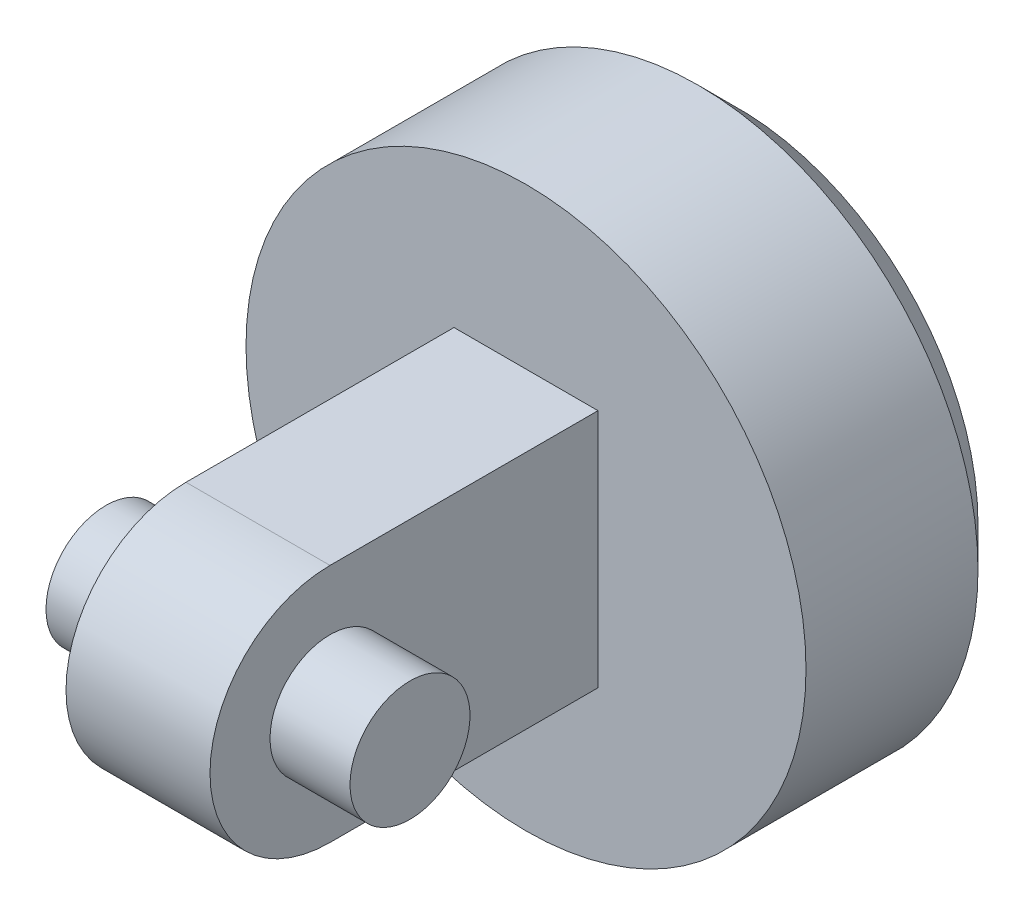
ISO-10303-21;
HEADER;
FILE_DESCRIPTION(('STEP AP214'),'2;1');
FILE_NAME('part.step','',(''),(''),'','','');
FILE_SCHEMA(('AUTOMOTIVE_DESIGN { 1 0 10303 214 1 1 1 1 }'));
ENDSEC;
DATA;
#1=APPLICATION_CONTEXT('core data for automotive mechanical design processes');
#2=APPLICATION_PROTOCOL_DEFINITION('international standard','automotive_design',2000,#1);
#3=PRODUCT_CONTEXT('',#1,'mechanical');
#4=PRODUCT('Part','Part','',(#3));
#5=PRODUCT_RELATED_PRODUCT_CATEGORY('part','',(#4));
#6=PRODUCT_DEFINITION_FORMATION('','',#4);
#7=PRODUCT_DEFINITION_CONTEXT('part definition',#1,'design');
#8=PRODUCT_DEFINITION('design','',#6,#7);
#9=PRODUCT_DEFINITION_SHAPE('','',#8);
#10=(LENGTH_UNIT() NAMED_UNIT(*) SI_UNIT(.MILLI.,.METRE.));
#11=(NAMED_UNIT(*) PLANE_ANGLE_UNIT() SI_UNIT($,.RADIAN.));
#12=(NAMED_UNIT(*) SI_UNIT($,.STERADIAN.) SOLID_ANGLE_UNIT());
#13=UNCERTAINTY_MEASURE_WITH_UNIT(LENGTH_MEASURE(1.E-05),#10,'distance_accuracy_value','');
#14=(GEOMETRIC_REPRESENTATION_CONTEXT(3) GLOBAL_UNCERTAINTY_ASSIGNED_CONTEXT((#13)) GLOBAL_UNIT_ASSIGNED_CONTEXT((#10,
#11,#12)) REPRESENTATION_CONTEXT('',''));
#15=CARTESIAN_POINT('',(0.,0.,0.));
#16=DIRECTION('',(0.,0.,1.));
#17=DIRECTION('',(1.,0.,0.));
#18=AXIS2_PLACEMENT_3D('',#15,#16,#17);
#19=CARTESIAN_POINT('',(-1.8,-3.,15.));
#20=DIRECTION('',(1.,0.,0.));
#21=DIRECTION('',(0.,0.,-1.));
#22=AXIS2_PLACEMENT_3D('',#19,#20,#21);
#23=PLANE('',#22);
#24=DIRECTION('',(0.,0.,-1.));
#25=VECTOR('',#24,1.);
#26=CARTESIAN_POINT('',(-1.8,-3.,15.));
#27=LINE('',#26,#25);
#28=CARTESIAN_POINT('',(-1.8,-3.,12.));
#29=VERTEX_POINT('',#28);
#30=CARTESIAN_POINT('',(-1.8,-3.,5.3));
#31=VERTEX_POINT('',#30);
#32=EDGE_CURVE('E57',#29,#31,#27,.T.);
#33=ORIENTED_EDGE('',*,*,#32,.F.);
#34=CARTESIAN_POINT('',(-1.8,0.,12.));
#35=DIRECTION('',(1.,0.,0.));
#36=DIRECTION('',(0.,0.,-1.));
#37=AXIS2_PLACEMENT_3D('',#34,#35,#36);
#38=CIRCLE('',#37,3.);
#39=CARTESIAN_POINT('',(-1.8,3.,12.));
#40=VERTEX_POINT('',#39);
#41=EDGE_CURVE('E50',#29,#40,#38,.F.);
#42=ORIENTED_EDGE('',*,*,#41,.T.);
#43=DIRECTION('',(0.,0.,-1.));
#44=VECTOR('',#43,1.);
#45=CARTESIAN_POINT('',(-1.8,3.,15.));
#46=LINE('',#45,#44);
#47=CARTESIAN_POINT('',(-1.8,3.,5.3));
#48=VERTEX_POINT('',#47);
#49=EDGE_CURVE('E78',#40,#48,#46,.T.);
#50=ORIENTED_EDGE('',*,*,#49,.T.);
#51=DIRECTION('',(0.,-1.,0.));
#52=VECTOR('',#51,1.);
#53=CARTESIAN_POINT('',(-1.8,-3.,5.3));
#54=LINE('',#53,#52);
#55=EDGE_CURVE('E128',#48,#31,#54,.T.);
#56=ORIENTED_EDGE('',*,*,#55,.T.);
#57=EDGE_LOOP('',(#33,#42,#50,#56));
#58=FACE_BOUND('',#57,.T.);
#59=CARTESIAN_POINT('',(-1.8,0.,12.));
#60=DIRECTION('',(1.,0.,0.));
#61=DIRECTION('',(0.,0.,-1.));
#62=AXIS2_PLACEMENT_3D('',#59,#60,#61);
#63=CIRCLE('',#62,1.5);
#64=CARTESIAN_POINT('',(-1.8,0.,10.5));
#65=VERTEX_POINT('',#64);
#66=EDGE_CURVE('E11',#65,#65,#63,.F.);
#67=ORIENTED_EDGE('',*,*,#66,.F.);
#68=EDGE_LOOP('',(#67));
#69=FACE_BOUND('',#68,.T.);
#70=ADVANCED_FACE('F35',(#58,#69),#23,.F.);
#71=CARTESIAN_POINT('',(-1.8,3.,15.));
#72=DIRECTION('',(0.,-1.,0.));
#73=DIRECTION('',(0.,0.,-1.));
#74=AXIS2_PLACEMENT_3D('',#71,#72,#73);
#75=PLANE('',#74);
#76=DIRECTION('',(1.,0.,0.));
#77=VECTOR('',#76,1.);
#78=CARTESIAN_POINT('',(-43.8493558709356,3.,12.));
#79=LINE('',#78,#77);
#80=CARTESIAN_POINT('',(1.8,3.,12.));
#81=VERTEX_POINT('',#80);
#82=EDGE_CURVE('E84',#40,#81,#79,.T.);
#83=ORIENTED_EDGE('',*,*,#82,.T.);
#84=DIRECTION('',(0.,0.,-1.));
#85=VECTOR('',#84,1.);
#86=CARTESIAN_POINT('',(1.8,3.,15.));
#87=LINE('',#86,#85);
#88=CARTESIAN_POINT('',(1.8,3.,5.3));
#89=VERTEX_POINT('',#88);
#90=EDGE_CURVE('E94',#81,#89,#87,.T.);
#91=ORIENTED_EDGE('',*,*,#90,.T.);
#92=DIRECTION('',(-1.,0.,0.));
#93=VECTOR('',#92,1.);
#94=CARTESIAN_POINT('',(-1.8,3.,5.3));
#95=LINE('',#94,#93);
#96=EDGE_CURVE('E92',#89,#48,#95,.T.);
#97=ORIENTED_EDGE('',*,*,#96,.T.);
#98=ORIENTED_EDGE('',*,*,#49,.F.);
#99=EDGE_LOOP('',(#83,#91,#97,#98));
#100=FACE_BOUND('',#99,.T.);
#101=ADVANCED_FACE('F90',(#100),#75,.F.);
#102=CARTESIAN_POINT('',(0.,0.,5.3));
#103=DIRECTION('',(0.,0.,1.));
#104=DIRECTION('',(1.,0.,0.));
#105=AXIS2_PLACEMENT_3D('',#102,#103,#104);
#106=PLANE('',#105);
#107=CARTESIAN_POINT('',(0.,0.,5.3));
#108=DIRECTION('',(0.,0.,1.));
#109=DIRECTION('',(1.,0.,0.));
#110=AXIS2_PLACEMENT_3D('',#107,#108,#109);
#111=CIRCLE('',#110,7.);
#112=CARTESIAN_POINT('',(7.,0.,5.3));
#113=VERTEX_POINT('',#112);
#114=EDGE_CURVE('E96',#113,#113,#111,.T.);
#115=ORIENTED_EDGE('',*,*,#114,.T.);
#116=EDGE_LOOP('',(#115));
#117=FACE_BOUND('',#116,.T.);
#118=ORIENTED_EDGE('',*,*,#96,.F.);
#119=DIRECTION('',(0.,1.,0.));
#120=VECTOR('',#119,1.);
#121=CARTESIAN_POINT('',(1.8,-3.,5.3));
#122=LINE('',#121,#120);
#123=CARTESIAN_POINT('',(1.8,-3.,5.3));
#124=VERTEX_POINT('',#123);
#125=EDGE_CURVE('E80',#124,#89,#122,.T.);
#126=ORIENTED_EDGE('',*,*,#125,.F.);
#127=DIRECTION('',(1.,0.,0.));
#128=VECTOR('',#127,1.);
#129=CARTESIAN_POINT('',(-1.8,-3.,5.3));
#130=LINE('',#129,#128);
#131=EDGE_CURVE('E130',#31,#124,#130,.T.);
#132=ORIENTED_EDGE('',*,*,#131,.F.);
#133=ORIENTED_EDGE('',*,*,#55,.F.);
#134=EDGE_LOOP('',(#118,#126,#132,#133));
#135=FACE_BOUND('',#134,.T.);
#136=ADVANCED_FACE('F119',(#117,#135),#106,.T.);
#137=CARTESIAN_POINT('',(0.,0.,5.3));
#138=DIRECTION('',(0.,0.,-1.));
#139=DIRECTION('',(-1.,0.,0.));
#140=AXIS2_PLACEMENT_3D('',#137,#138,#139);
#141=CYLINDRICAL_SURFACE('',#140,7.);
#142=CARTESIAN_POINT('',(0.,0.,0.999999999999998));
#143=DIRECTION('',(0.,0.,1.));
#144=DIRECTION('',(1.,0.,0.));
#145=AXIS2_PLACEMENT_3D('',#142,#143,#144);
#146=CIRCLE('',#145,7.);
#147=CARTESIAN_POINT('',(7.,0.,0.999999999999998));
#148=VERTEX_POINT('',#147);
#149=EDGE_CURVE('E104',#148,#148,#146,.T.);
#150=ORIENTED_EDGE('',*,*,#149,.T.);
#151=EDGE_LOOP('',(#150));
#152=FACE_BOUND('',#151,.T.);
#153=ORIENTED_EDGE('',*,*,#114,.F.);
#154=EDGE_LOOP('',(#153));
#155=FACE_BOUND('',#154,.T.);
#156=ADVANCED_FACE('F116',(#152,#155),#141,.T.);
#157=CARTESIAN_POINT('',(0.,0.,0.));
#158=DIRECTION('',(0.,0.,1.));
#159=DIRECTION('',(1.,0.,0.));
#160=AXIS2_PLACEMENT_3D('',#157,#158,#159);
#161=PLANE('',#160);
#162=CARTESIAN_POINT('',(0.,0.,0.));
#163=DIRECTION('',(0.,0.,1.));
#164=DIRECTION('',(1.,0.,0.));
#165=AXIS2_PLACEMENT_3D('',#162,#163,#164);
#166=CIRCLE('',#165,5.99999999999999);
#167=CARTESIAN_POINT('',(5.99999999999999,0.,0.));
#168=VERTEX_POINT('',#167);
#169=EDGE_CURVE('E43',#168,#168,#166,.F.);
#170=ORIENTED_EDGE('',*,*,#169,.T.);
#171=EDGE_LOOP('',(#170));
#172=FACE_BOUND('',#171,.T.);
#173=ADVANCED_FACE('F109',(#172),#161,.F.);
#174=CARTESIAN_POINT('',(1.8,-3.,15.));
#175=DIRECTION('',(-1.,0.,0.));
#176=DIRECTION('',(0.,0.,1.));
#177=AXIS2_PLACEMENT_3D('',#174,#175,#176);
#178=PLANE('',#177);
#179=CARTESIAN_POINT('',(1.8,0.,12.));
#180=DIRECTION('',(-1.,0.,0.));
#181=DIRECTION('',(0.,0.,1.));
#182=AXIS2_PLACEMENT_3D('',#179,#180,#181);
#183=CIRCLE('',#182,1.5);
#184=CARTESIAN_POINT('',(1.8,0.,13.5));
#185=VERTEX_POINT('',#184);
#186=EDGE_CURVE('E213',#185,#185,#183,.T.);
#187=ORIENTED_EDGE('',*,*,#186,.T.);
#188=EDGE_LOOP('',(#187));
#189=FACE_BOUND('',#188,.T.);
#190=CARTESIAN_POINT('',(1.8,0.,12.));
#191=DIRECTION('',(-1.,0.,0.));
#192=DIRECTION('',(0.,0.,1.));
#193=AXIS2_PLACEMENT_3D('',#190,#191,#192);
#194=CIRCLE('',#193,3.);
#195=CARTESIAN_POINT('',(1.8,-3.,12.));
#196=VERTEX_POINT('',#195);
#197=EDGE_CURVE('E81',#81,#196,#194,.F.);
#198=ORIENTED_EDGE('',*,*,#197,.T.);
#199=DIRECTION('',(0.,0.,-1.));
#200=VECTOR('',#199,1.);
#201=CARTESIAN_POINT('',(1.8,-3.,15.));
#202=LINE('',#201,#200);
#203=EDGE_CURVE('E98',#196,#124,#202,.T.);
#204=ORIENTED_EDGE('',*,*,#203,.T.);
#205=ORIENTED_EDGE('',*,*,#125,.T.);
#206=ORIENTED_EDGE('',*,*,#90,.F.);
#207=EDGE_LOOP('',(#198,#204,#205,#206));
#208=FACE_BOUND('',#207,.T.);
#209=ADVANCED_FACE('F137',(#189,#208),#178,.F.);
#210=CARTESIAN_POINT('',(-1.8,-3.,15.));
#211=DIRECTION('',(0.,1.,0.));
#212=DIRECTION('',(0.,0.,1.));
#213=AXIS2_PLACEMENT_3D('',#210,#211,#212);
#214=PLANE('',#213);
#215=ORIENTED_EDGE('',*,*,#203,.F.);
#216=DIRECTION('',(1.,0.,0.));
#217=VECTOR('',#216,1.);
#218=CARTESIAN_POINT('',(-43.8493558709356,-3.,12.));
#219=LINE('',#218,#217);
#220=EDGE_CURVE('E88',#29,#196,#219,.T.);
#221=ORIENTED_EDGE('',*,*,#220,.F.);
#222=ORIENTED_EDGE('',*,*,#32,.T.);
#223=ORIENTED_EDGE('',*,*,#131,.T.);
#224=EDGE_LOOP('',(#215,#221,#222,#223));
#225=FACE_BOUND('',#224,.T.);
#226=ADVANCED_FACE('F138',(#225),#214,.F.);
#227=CARTESIAN_POINT('',(-43.8493558709356,0.,12.));
#228=DIRECTION('',(1.,0.,0.));
#229=DIRECTION('',(0.,0.,-1.));
#230=AXIS2_PLACEMENT_3D('',#227,#228,#229);
#231=CYLINDRICAL_SURFACE('',#230,3.);
#232=ORIENTED_EDGE('',*,*,#220,.T.);
#233=ORIENTED_EDGE('',*,*,#197,.F.);
#234=ORIENTED_EDGE('',*,*,#82,.F.);
#235=ORIENTED_EDGE('',*,*,#41,.F.);
#236=EDGE_LOOP('',(#232,#233,#234,#235));
#237=FACE_BOUND('',#236,.T.);
#238=ADVANCED_FACE('F85',(#237),#231,.T.);
#239=CARTESIAN_POINT('',(0.,0.,0.999999999999998));
#240=DIRECTION('',(0.,0.,1.));
#241=DIRECTION('',(1.,0.,0.));
#242=AXIS2_PLACEMENT_3D('',#239,#240,#241);
#243=CONICAL_SURFACE('',#242,7.,0.785398163397452);
#244=ORIENTED_EDGE('',*,*,#169,.F.);
#245=EDGE_LOOP('',(#244));
#246=FACE_BOUND('',#245,.T.);
#247=ORIENTED_EDGE('',*,*,#149,.F.);
#248=EDGE_LOOP('',(#247));
#249=FACE_BOUND('',#248,.T.);
#250=ADVANCED_FACE('F37',(#246,#249),#243,.T.);
#251=CARTESIAN_POINT('',(-3.8,0.,12.));
#252=DIRECTION('',(1.,0.,0.));
#253=DIRECTION('',(0.,0.,-1.));
#254=AXIS2_PLACEMENT_3D('',#251,#252,#253);
#255=CYLINDRICAL_SURFACE('',#254,1.5);
#256=CARTESIAN_POINT('',(-3.8,0.,12.));
#257=DIRECTION('',(-1.,0.,0.));
#258=DIRECTION('',(0.,0.,1.));
#259=AXIS2_PLACEMENT_3D('',#256,#257,#258);
#260=CIRCLE('',#259,1.5);
#261=CARTESIAN_POINT('',(-3.8,0.,13.5));
#262=VERTEX_POINT('',#261);
#263=EDGE_CURVE('E207',#262,#262,#260,.T.);
#264=ORIENTED_EDGE('',*,*,#263,.F.);
#265=EDGE_LOOP('',(#264));
#266=FACE_BOUND('',#265,.T.);
#267=ORIENTED_EDGE('',*,*,#66,.T.);
#268=EDGE_LOOP('',(#267));
#269=FACE_BOUND('',#268,.T.);
#270=ADVANCED_FACE('F113',(#266,#269),#255,.T.);
#271=CARTESIAN_POINT('',(-3.8,0.,12.));
#272=DIRECTION('',(-1.,0.,0.));
#273=DIRECTION('',(0.,0.,1.));
#274=AXIS2_PLACEMENT_3D('',#271,#272,#273);
#275=PLANE('',#274);
#276=ORIENTED_EDGE('',*,*,#263,.T.);
#277=EDGE_LOOP('',(#276));
#278=FACE_BOUND('',#277,.T.);
#279=ADVANCED_FACE('F173',(#278),#275,.T.);
#280=CARTESIAN_POINT('',(3.8,0.,12.));
#281=DIRECTION('',(-1.,0.,0.));
#282=DIRECTION('',(0.,0.,1.));
#283=AXIS2_PLACEMENT_3D('',#280,#281,#282);
#284=CYLINDRICAL_SURFACE('',#283,1.5);
#285=CARTESIAN_POINT('',(3.8,0.,12.));
#286=DIRECTION('',(-1.,0.,0.));
#287=DIRECTION('',(0.,0.,1.));
#288=AXIS2_PLACEMENT_3D('',#285,#286,#287);
#289=CIRCLE('',#288,1.5);
#290=CARTESIAN_POINT('',(3.8,0.,13.5));
#291=VERTEX_POINT('',#290);
#292=EDGE_CURVE('E209',#291,#291,#289,.T.);
#293=ORIENTED_EDGE('',*,*,#292,.T.);
#294=EDGE_LOOP('',(#293));
#295=FACE_BOUND('',#294,.T.);
#296=ORIENTED_EDGE('',*,*,#186,.F.);
#297=EDGE_LOOP('',(#296));
#298=FACE_BOUND('',#297,.T.);
#299=ADVANCED_FACE('F178',(#295,#298),#284,.T.);
#300=CARTESIAN_POINT('',(3.8,0.,12.));
#301=DIRECTION('',(1.,0.,0.));
#302=DIRECTION('',(0.,0.,1.));
#303=AXIS2_PLACEMENT_3D('',#300,#301,#302);
#304=PLANE('',#303);
#305=ORIENTED_EDGE('',*,*,#292,.F.);
#306=EDGE_LOOP('',(#305));
#307=FACE_BOUND('',#306,.T.);
#308=ADVANCED_FACE('F183',(#307),#304,.T.);
#309=CLOSED_SHELL('',(#70,#101,#136,#156,#173,#209,#226,#238,#250,#270,#279,#299,#308));
#310=MANIFOLD_SOLID_BREP('B2',#309);
#311=ADVANCED_BREP_SHAPE_REPRESENTATION('',(#18,#310),#14);
#312=SHAPE_DEFINITION_REPRESENTATION(#9,#311);
ENDSEC;
END-ISO-10303-21;
